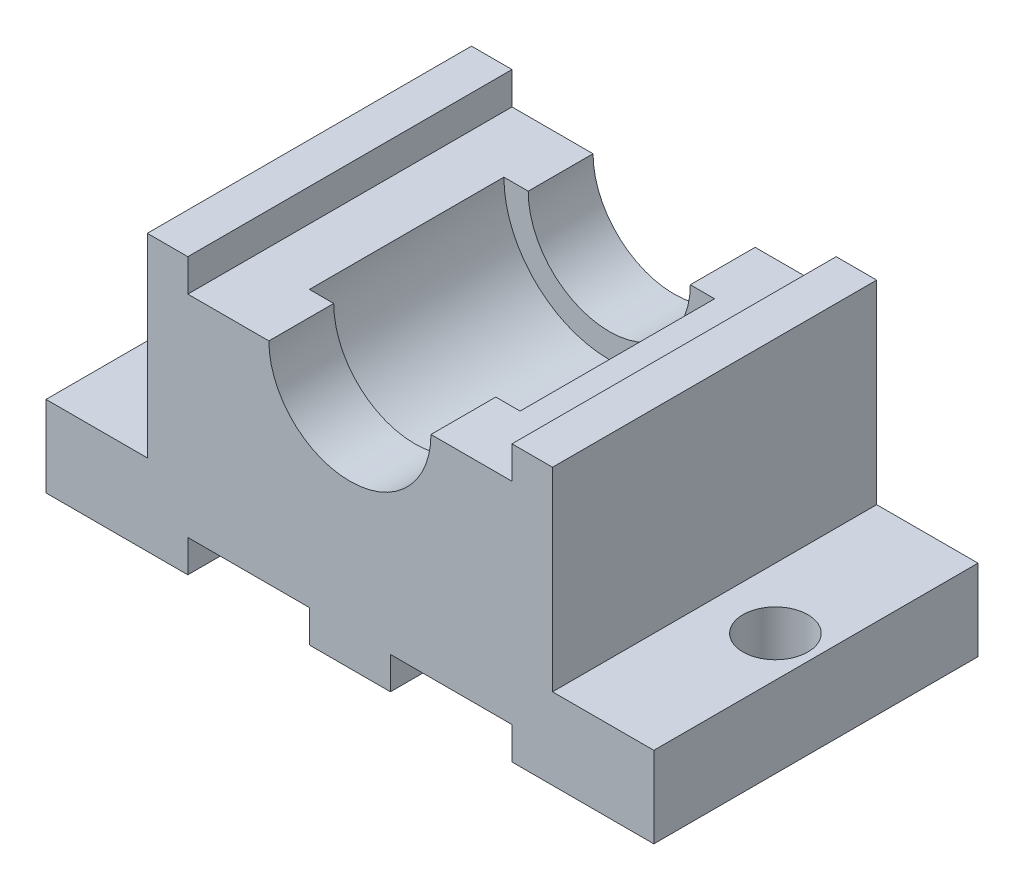
ISO-10303-21;
HEADER;
FILE_DESCRIPTION(('STEP AP214'),'2;1');
FILE_NAME('part.step','',(''),(''),'','','');
FILE_SCHEMA(('AUTOMOTIVE_DESIGN { 1 0 10303 214 1 1 1 1 }'));
ENDSEC;
DATA;
#1=APPLICATION_CONTEXT('core data for automotive mechanical design processes');
#2=APPLICATION_PROTOCOL_DEFINITION('international standard','automotive_design',2000,#1);
#3=PRODUCT_CONTEXT('',#1,'mechanical');
#4=PRODUCT('Part','Part','',(#3));
#5=PRODUCT_RELATED_PRODUCT_CATEGORY('part','',(#4));
#6=PRODUCT_DEFINITION_FORMATION('','',#4);
#7=PRODUCT_DEFINITION_CONTEXT('part definition',#1,'design');
#8=PRODUCT_DEFINITION('design','',#6,#7);
#9=PRODUCT_DEFINITION_SHAPE('','',#8);
#10=(LENGTH_UNIT() NAMED_UNIT(*) SI_UNIT(.MILLI.,.METRE.));
#11=(NAMED_UNIT(*) PLANE_ANGLE_UNIT() SI_UNIT($,.RADIAN.));
#12=(NAMED_UNIT(*) SI_UNIT($,.STERADIAN.) SOLID_ANGLE_UNIT());
#13=UNCERTAINTY_MEASURE_WITH_UNIT(LENGTH_MEASURE(1.E-05),#10,'distance_accuracy_value','');
#14=(GEOMETRIC_REPRESENTATION_CONTEXT(3) GLOBAL_UNCERTAINTY_ASSIGNED_CONTEXT((#13)) GLOBAL_UNIT_ASSIGNED_CONTEXT((#10,
#11,#12)) REPRESENTATION_CONTEXT('',''));
#15=CARTESIAN_POINT('',(0.,0.,0.));
#16=DIRECTION('',(0.,0.,1.));
#17=DIRECTION('',(1.,0.,0.));
#18=AXIS2_PLACEMENT_3D('',#15,#16,#17);
#19=CARTESIAN_POINT('',(20.,30.,20.));
#20=DIRECTION('',(0.,-1.,0.));
#21=DIRECTION('',(1.,0.,0.));
#22=AXIS2_PLACEMENT_3D('',#19,#20,#21);
#23=PLANE('',#22);
#24=DIRECTION('',(-1.,0.,0.));
#25=VECTOR('',#24,1.);
#26=CARTESIAN_POINT('',(20.,30.,-12.));
#27=LINE('',#26,#25);
#28=CARTESIAN_POINT('',(13.,30.,-12.));
#29=VERTEX_POINT('',#28);
#30=CARTESIAN_POINT('',(10.,30.,-12.));
#31=VERTEX_POINT('',#30);
#32=EDGE_CURVE('E436',#29,#31,#27,.T.);
#33=ORIENTED_EDGE('',*,*,#32,.F.);
#34=DIRECTION('',(0.,0.,1.));
#35=VECTOR('',#34,1.);
#36=CARTESIAN_POINT('',(13.,30.,-12.));
#37=LINE('',#36,#35);
#38=CARTESIAN_POINT('',(13.,30.,12.));
#39=VERTEX_POINT('',#38);
#40=EDGE_CURVE('E248',#29,#39,#37,.T.);
#41=ORIENTED_EDGE('',*,*,#40,.T.);
#42=DIRECTION('',(-1.,0.,0.));
#43=VECTOR('',#42,1.);
#44=CARTESIAN_POINT('',(20.,30.,12.));
#45=LINE('',#44,#43);
#46=CARTESIAN_POINT('',(10.,30.,12.));
#47=VERTEX_POINT('',#46);
#48=EDGE_CURVE('E421',#39,#47,#45,.T.);
#49=ORIENTED_EDGE('',*,*,#48,.T.);
#50=DIRECTION('',(0.,0.,-1.));
#51=VECTOR('',#50,1.);
#52=CARTESIAN_POINT('',(10.,30.,20.));
#53=LINE('',#52,#51);
#54=CARTESIAN_POINT('',(10.,30.,20.));
#55=VERTEX_POINT('',#54);
#56=EDGE_CURVE('E352',#55,#47,#53,.T.);
#57=ORIENTED_EDGE('',*,*,#56,.F.);
#58=DIRECTION('',(-1.,0.,0.));
#59=VECTOR('',#58,1.);
#60=CARTESIAN_POINT('',(20.,30.,20.));
#61=LINE('',#60,#59);
#62=CARTESIAN_POINT('',(20.,30.,20.));
#63=VERTEX_POINT('',#62);
#64=EDGE_CURVE('E466',#63,#55,#61,.T.);
#65=ORIENTED_EDGE('',*,*,#64,.F.);
#66=DIRECTION('',(0.,0.,-1.));
#67=VECTOR('',#66,1.);
#68=CARTESIAN_POINT('',(20.,30.,20.));
#69=LINE('',#68,#67);
#70=CARTESIAN_POINT('',(20.,30.,-20.));
#71=VERTEX_POINT('',#70);
#72=EDGE_CURVE('E356',#63,#71,#69,.T.);
#73=ORIENTED_EDGE('',*,*,#72,.T.);
#74=DIRECTION('',(-1.,0.,0.));
#75=VECTOR('',#74,1.);
#76=CARTESIAN_POINT('',(20.,30.,-20.));
#77=LINE('',#76,#75);
#78=CARTESIAN_POINT('',(10.,30.,-20.));
#79=VERTEX_POINT('',#78);
#80=EDGE_CURVE('E272',#71,#79,#77,.T.);
#81=ORIENTED_EDGE('',*,*,#80,.T.);
#82=EDGE_CURVE('E351',#31,#79,#53,.T.);
#83=ORIENTED_EDGE('',*,*,#82,.F.);
#84=EDGE_LOOP('',(#33,#41,#49,#57,#65,#73,#81,#83));
#85=FACE_BOUND('',#84,.T.);
#86=ADVANCED_FACE('F45',(#85),#23,.F.);
#87=CARTESIAN_POINT('',(0.,30.,20.));
#88=DIRECTION('',(0.,0.,-1.));
#89=DIRECTION('',(-1.,0.,0.));
#90=AXIS2_PLACEMENT_3D('',#87,#88,#89);
#91=CYLINDRICAL_SURFACE('',#90,10.);
#92=CARTESIAN_POINT('',(0.,30.,-12.));
#93=DIRECTION('',(0.,0.,1.));
#94=DIRECTION('',(1.,0.,0.));
#95=AXIS2_PLACEMENT_3D('',#92,#93,#94);
#96=CIRCLE('',#95,10.);
#97=CARTESIAN_POINT('',(-10.,30.,-12.));
#98=VERTEX_POINT('',#97);
#99=EDGE_CURVE('E432',#31,#98,#96,.F.);
#100=ORIENTED_EDGE('',*,*,#99,.F.);
#101=ORIENTED_EDGE('',*,*,#82,.T.);
#102=CARTESIAN_POINT('',(0.,30.,-20.));
#103=DIRECTION('',(0.,0.,-1.));
#104=DIRECTION('',(1.,0.,0.));
#105=AXIS2_PLACEMENT_3D('',#102,#103,#104);
#106=CIRCLE('',#105,10.);
#107=CARTESIAN_POINT('',(-10.,30.,-20.));
#108=VERTEX_POINT('',#107);
#109=EDGE_CURVE('E276',#79,#108,#106,.T.);
#110=ORIENTED_EDGE('',*,*,#109,.T.);
#111=DIRECTION('',(0.,0.,-1.));
#112=VECTOR('',#111,1.);
#113=CARTESIAN_POINT('',(-10.,30.,20.));
#114=LINE('',#113,#112);
#115=EDGE_CURVE('E346',#98,#108,#114,.T.);
#116=ORIENTED_EDGE('',*,*,#115,.F.);
#117=EDGE_LOOP('',(#100,#101,#110,#116));
#118=FACE_BOUND('',#117,.T.);
#119=ADVANCED_FACE('F585',(#118),#91,.F.);
#120=CARTESIAN_POINT('',(-20.,30.,20.));
#121=DIRECTION('',(0.,-1.,0.));
#122=DIRECTION('',(1.,0.,0.));
#123=AXIS2_PLACEMENT_3D('',#120,#121,#122);
#124=PLANE('',#123);
#125=DIRECTION('',(-1.,0.,0.));
#126=VECTOR('',#125,1.);
#127=CARTESIAN_POINT('',(-20.,30.,-12.));
#128=LINE('',#127,#126);
#129=CARTESIAN_POINT('',(-13.,30.,-12.));
#130=VERTEX_POINT('',#129);
#131=EDGE_CURVE('E11',#98,#130,#128,.T.);
#132=ORIENTED_EDGE('',*,*,#131,.F.);
#133=ORIENTED_EDGE('',*,*,#115,.T.);
#134=DIRECTION('',(-1.,0.,0.));
#135=VECTOR('',#134,1.);
#136=CARTESIAN_POINT('',(-20.,30.,-20.));
#137=LINE('',#136,#135);
#138=CARTESIAN_POINT('',(-20.,30.,-20.));
#139=VERTEX_POINT('',#138);
#140=EDGE_CURVE('E280',#108,#139,#137,.T.);
#141=ORIENTED_EDGE('',*,*,#140,.T.);
#142=DIRECTION('',(0.,0.,-1.));
#143=VECTOR('',#142,1.);
#144=CARTESIAN_POINT('',(-20.,30.,20.));
#145=LINE('',#144,#143);
#146=CARTESIAN_POINT('',(-20.,30.,20.));
#147=VERTEX_POINT('',#146);
#148=EDGE_CURVE('E342',#147,#139,#145,.T.);
#149=ORIENTED_EDGE('',*,*,#148,.F.);
#150=DIRECTION('',(-1.,0.,0.));
#151=VECTOR('',#150,1.);
#152=CARTESIAN_POINT('',(-20.,30.,20.));
#153=LINE('',#152,#151);
#154=CARTESIAN_POINT('',(-10.,30.,20.));
#155=VERTEX_POINT('',#154);
#156=EDGE_CURVE('E472',#155,#147,#153,.T.);
#157=ORIENTED_EDGE('',*,*,#156,.F.);
#158=CARTESIAN_POINT('',(-10.,30.,12.));
#159=VERTEX_POINT('',#158);
#160=EDGE_CURVE('E347',#155,#159,#114,.T.);
#161=ORIENTED_EDGE('',*,*,#160,.T.);
#162=DIRECTION('',(-1.,0.,0.));
#163=VECTOR('',#162,1.);
#164=CARTESIAN_POINT('',(-20.,30.,12.));
#165=LINE('',#164,#163);
#166=CARTESIAN_POINT('',(-13.,30.,12.));
#167=VERTEX_POINT('',#166);
#168=EDGE_CURVE('E391',#159,#167,#165,.T.);
#169=ORIENTED_EDGE('',*,*,#168,.T.);
#170=DIRECTION('',(0.,0.,1.));
#171=VECTOR('',#170,1.);
#172=CARTESIAN_POINT('',(-13.,30.,-12.));
#173=LINE('',#172,#171);
#174=EDGE_CURVE('E54',#167,#130,#173,.F.);
#175=ORIENTED_EDGE('',*,*,#174,.T.);
#176=EDGE_LOOP('',(#132,#133,#141,#149,#157,#161,#169,#175));
#177=FACE_BOUND('',#176,.T.);
#178=ADVANCED_FACE('F399',(#177),#124,.F.);
#179=CARTESIAN_POINT('',(5.,0.,20.));
#180=DIRECTION('',(-1.,0.,0.));
#181=DIRECTION('',(0.,0.,1.));
#182=AXIS2_PLACEMENT_3D('',#179,#180,#181);
#183=PLANE('',#182);
#184=DIRECTION('',(0.,1.,0.));
#185=VECTOR('',#184,1.);
#186=CARTESIAN_POINT('',(5.,0.,-20.));
#187=LINE('',#186,#185);
#188=CARTESIAN_POINT('',(5.,0.,-20.));
#189=VERTEX_POINT('',#188);
#190=CARTESIAN_POINT('',(5.,3.99999999999998,-20.));
#191=VERTEX_POINT('',#190);
#192=EDGE_CURVE('E243',#189,#191,#187,.T.);
#193=ORIENTED_EDGE('',*,*,#192,.T.);
#194=DIRECTION('',(0.,0.,-1.));
#195=VECTOR('',#194,1.);
#196=CARTESIAN_POINT('',(5.,3.99999999999998,20.));
#197=LINE('',#196,#195);
#198=CARTESIAN_POINT('',(5.,3.99999999999998,20.));
#199=VERTEX_POINT('',#198);
#200=EDGE_CURVE('E388',#199,#191,#197,.T.);
#201=ORIENTED_EDGE('',*,*,#200,.F.);
#202=DIRECTION('',(0.,1.,0.));
#203=VECTOR('',#202,1.);
#204=CARTESIAN_POINT('',(5.,0.,20.));
#205=LINE('',#204,#203);
#206=CARTESIAN_POINT('',(5.,0.,20.));
#207=VERTEX_POINT('',#206);
#208=EDGE_CURVE('E311',#207,#199,#205,.T.);
#209=ORIENTED_EDGE('',*,*,#208,.F.);
#210=DIRECTION('',(0.,0.,-1.));
#211=VECTOR('',#210,1.);
#212=CARTESIAN_POINT('',(5.,0.,20.));
#213=LINE('',#212,#211);
#214=EDGE_CURVE('E239',#207,#189,#213,.T.);
#215=ORIENTED_EDGE('',*,*,#214,.T.);
#216=EDGE_LOOP('',(#193,#201,#209,#215));
#217=FACE_BOUND('',#216,.T.);
#218=ADVANCED_FACE('F47',(#217),#183,.F.);
#219=CARTESIAN_POINT('',(5.,3.99999999999998,20.));
#220=DIRECTION('',(0.,1.,0.));
#221=DIRECTION('',(0.,0.,1.));
#222=AXIS2_PLACEMENT_3D('',#219,#220,#221);
#223=PLANE('',#222);
#224=DIRECTION('',(1.,0.,0.));
#225=VECTOR('',#224,1.);
#226=CARTESIAN_POINT('',(5.,3.99999999999998,-20.));
#227=LINE('',#226,#225);
#228=CARTESIAN_POINT('',(20.,3.99999999999998,-20.));
#229=VERTEX_POINT('',#228);
#230=EDGE_CURVE('E247',#191,#229,#227,.T.);
#231=ORIENTED_EDGE('',*,*,#230,.T.);
#232=DIRECTION('',(0.,0.,-1.));
#233=VECTOR('',#232,1.);
#234=CARTESIAN_POINT('',(20.,3.99999999999998,20.));
#235=LINE('',#234,#233);
#236=CARTESIAN_POINT('',(20.,3.99999999999998,20.));
#237=VERTEX_POINT('',#236);
#238=EDGE_CURVE('E384',#237,#229,#235,.T.);
#239=ORIENTED_EDGE('',*,*,#238,.F.);
#240=DIRECTION('',(1.,0.,0.));
#241=VECTOR('',#240,1.);
#242=CARTESIAN_POINT('',(5.,3.99999999999998,20.));
#243=LINE('',#242,#241);
#244=EDGE_CURVE('E154',#199,#237,#243,.T.);
#245=ORIENTED_EDGE('',*,*,#244,.F.);
#246=ORIENTED_EDGE('',*,*,#200,.T.);
#247=EDGE_LOOP('',(#231,#239,#245,#246));
#248=FACE_BOUND('',#247,.T.);
#249=ADVANCED_FACE('F512',(#248),#223,.F.);
#250=CARTESIAN_POINT('',(20.,3.99999999999998,20.));
#251=DIRECTION('',(1.,0.,0.));
#252=DIRECTION('',(0.,1.,0.));
#253=AXIS2_PLACEMENT_3D('',#250,#251,#252);
#254=PLANE('',#253);
#255=DIRECTION('',(0.,-1.,0.));
#256=VECTOR('',#255,1.);
#257=CARTESIAN_POINT('',(20.,3.99999999999998,-20.));
#258=LINE('',#257,#256);
#259=CARTESIAN_POINT('',(20.,0.,-20.));
#260=VERTEX_POINT('',#259);
#261=EDGE_CURVE('E251',#229,#260,#258,.T.);
#262=ORIENTED_EDGE('',*,*,#261,.T.);
#263=DIRECTION('',(0.,0.,-1.));
#264=VECTOR('',#263,1.);
#265=CARTESIAN_POINT('',(20.,0.,20.));
#266=LINE('',#265,#264);
#267=CARTESIAN_POINT('',(20.,0.,20.));
#268=VERTEX_POINT('',#267);
#269=EDGE_CURVE('E380',#268,#260,#266,.T.);
#270=ORIENTED_EDGE('',*,*,#269,.F.);
#271=DIRECTION('',(0.,-1.,0.));
#272=VECTOR('',#271,1.);
#273=CARTESIAN_POINT('',(20.,3.99999999999998,20.));
#274=LINE('',#273,#272);
#275=EDGE_CURVE('E445',#237,#268,#274,.T.);
#276=ORIENTED_EDGE('',*,*,#275,.F.);
#277=ORIENTED_EDGE('',*,*,#238,.T.);
#278=EDGE_LOOP('',(#262,#270,#276,#277));
#279=FACE_BOUND('',#278,.T.);
#280=ADVANCED_FACE('F515',(#279),#254,.F.);
#281=CARTESIAN_POINT('',(20.,0.,20.));
#282=DIRECTION('',(0.,1.,0.));
#283=DIRECTION('',(-1.,0.,0.));
#284=AXIS2_PLACEMENT_3D('',#281,#282,#283);
#285=PLANE('',#284);
#286=CARTESIAN_POINT('',(32.5,0.,0.));
#287=DIRECTION('',(0.,1.,0.));
#288=DIRECTION('',(1.,0.,0.));
#289=AXIS2_PLACEMENT_3D('',#286,#287,#288);
#290=CIRCLE('',#289,4.00000000000001);
#291=CARTESIAN_POINT('',(28.5,0.,0.));
#292=VERTEX_POINT('',#291);
#293=EDGE_CURVE('E426',#292,#292,#290,.T.);
#294=ORIENTED_EDGE('',*,*,#293,.T.);
#295=EDGE_LOOP('',(#294));
#296=FACE_BOUND('',#295,.T.);
#297=DIRECTION('',(1.,0.,0.));
#298=VECTOR('',#297,1.);
#299=CARTESIAN_POINT('',(20.,0.,-20.));
#300=LINE('',#299,#298);
#301=CARTESIAN_POINT('',(37.5,0.,-20.));
#302=VERTEX_POINT('',#301);
#303=EDGE_CURVE('E254',#260,#302,#300,.T.);
#304=ORIENTED_EDGE('',*,*,#303,.T.);
#305=DIRECTION('',(0.,0.,-1.));
#306=VECTOR('',#305,1.);
#307=CARTESIAN_POINT('',(37.5,0.,20.));
#308=LINE('',#307,#306);
#309=CARTESIAN_POINT('',(37.5,0.,20.));
#310=VERTEX_POINT('',#309);
#311=EDGE_CURVE('E376',#310,#302,#308,.T.);
#312=ORIENTED_EDGE('',*,*,#311,.F.);
#313=DIRECTION('',(1.,0.,0.));
#314=VECTOR('',#313,1.);
#315=CARTESIAN_POINT('',(20.,0.,20.));
#316=LINE('',#315,#314);
#317=EDGE_CURVE('E448',#268,#310,#316,.T.);
#318=ORIENTED_EDGE('',*,*,#317,.F.);
#319=ORIENTED_EDGE('',*,*,#269,.T.);
#320=EDGE_LOOP('',(#304,#312,#318,#319));
#321=FACE_BOUND('',#320,.T.);
#322=ADVANCED_FACE('F520',(#296,#321),#285,.F.);
#323=CARTESIAN_POINT('',(37.5,0.,20.));
#324=DIRECTION('',(-1.,0.,0.));
#325=DIRECTION('',(0.,-1.,0.));
#326=AXIS2_PLACEMENT_3D('',#323,#324,#325);
#327=PLANE('',#326);
#328=DIRECTION('',(0.,1.,0.));
#329=VECTOR('',#328,1.);
#330=CARTESIAN_POINT('',(37.5,0.,-20.));
#331=LINE('',#330,#329);
#332=CARTESIAN_POINT('',(37.5,9.99999999999997,-20.));
#333=VERTEX_POINT('',#332);
#334=EDGE_CURVE('E257',#302,#333,#331,.T.);
#335=ORIENTED_EDGE('',*,*,#334,.T.);
#336=DIRECTION('',(0.,0.,-1.));
#337=VECTOR('',#336,1.);
#338=CARTESIAN_POINT('',(37.5,9.99999999999997,20.));
#339=LINE('',#338,#337);
#340=CARTESIAN_POINT('',(37.5,9.99999999999997,20.));
#341=VERTEX_POINT('',#340);
#342=EDGE_CURVE('E372',#341,#333,#339,.T.);
#343=ORIENTED_EDGE('',*,*,#342,.F.);
#344=DIRECTION('',(0.,1.,0.));
#345=VECTOR('',#344,1.);
#346=CARTESIAN_POINT('',(37.5,0.,20.));
#347=LINE('',#346,#345);
#348=EDGE_CURVE('E451',#310,#341,#347,.T.);
#349=ORIENTED_EDGE('',*,*,#348,.F.);
#350=ORIENTED_EDGE('',*,*,#311,.T.);
#351=EDGE_LOOP('',(#335,#343,#349,#350));
#352=FACE_BOUND('',#351,.T.);
#353=ADVANCED_FACE('F526',(#352),#327,.F.);
#354=CARTESIAN_POINT('',(37.5,9.99999999999997,20.));
#355=DIRECTION('',(0.,-1.,0.));
#356=DIRECTION('',(1.,0.,0.));
#357=AXIS2_PLACEMENT_3D('',#354,#355,#356);
#358=PLANE('',#357);
#359=CARTESIAN_POINT('',(32.5,9.99999999999998,0.));
#360=DIRECTION('',(0.,1.,0.));
#361=DIRECTION('',(1.,0.,0.));
#362=AXIS2_PLACEMENT_3D('',#359,#360,#361);
#363=CIRCLE('',#362,4.00000000000001);
#364=CARTESIAN_POINT('',(28.5,9.99999999999998,0.));
#365=VERTEX_POINT('',#364);
#366=EDGE_CURVE('E706',#365,#365,#363,.T.);
#367=ORIENTED_EDGE('',*,*,#366,.F.);
#368=EDGE_LOOP('',(#367));
#369=FACE_BOUND('',#368,.T.);
#370=DIRECTION('',(-1.,0.,0.));
#371=VECTOR('',#370,1.);
#372=CARTESIAN_POINT('',(37.5,9.99999999999997,-20.));
#373=LINE('',#372,#371);
#374=CARTESIAN_POINT('',(25.,9.99999999999998,-20.));
#375=VERTEX_POINT('',#374);
#376=EDGE_CURVE('E260',#333,#375,#373,.T.);
#377=ORIENTED_EDGE('',*,*,#376,.T.);
#378=DIRECTION('',(0.,0.,-1.));
#379=VECTOR('',#378,1.);
#380=CARTESIAN_POINT('',(25.,9.99999999999998,20.));
#381=LINE('',#380,#379);
#382=CARTESIAN_POINT('',(25.,9.99999999999998,20.));
#383=VERTEX_POINT('',#382);
#384=EDGE_CURVE('E368',#383,#375,#381,.T.);
#385=ORIENTED_EDGE('',*,*,#384,.F.);
#386=DIRECTION('',(-1.,0.,0.));
#387=VECTOR('',#386,1.);
#388=CARTESIAN_POINT('',(37.5,9.99999999999997,20.));
#389=LINE('',#388,#387);
#390=EDGE_CURVE('E454',#341,#383,#389,.T.);
#391=ORIENTED_EDGE('',*,*,#390,.F.);
#392=ORIENTED_EDGE('',*,*,#342,.T.);
#393=EDGE_LOOP('',(#377,#385,#391,#392));
#394=FACE_BOUND('',#393,.T.);
#395=ADVANCED_FACE('F530',(#369,#394),#358,.F.);
#396=CARTESIAN_POINT('',(25.,9.99999999999998,20.));
#397=DIRECTION('',(-1.,0.,0.));
#398=DIRECTION('',(0.,0.,1.));
#399=AXIS2_PLACEMENT_3D('',#396,#397,#398);
#400=PLANE('',#399);
#401=DIRECTION('',(0.,1.,0.));
#402=VECTOR('',#401,1.);
#403=CARTESIAN_POINT('',(25.,9.99999999999998,-20.));
#404=LINE('',#403,#402);
#405=CARTESIAN_POINT('',(25.,34.,-20.));
#406=VERTEX_POINT('',#405);
#407=EDGE_CURVE('E263',#375,#406,#404,.T.);
#408=ORIENTED_EDGE('',*,*,#407,.T.);
#409=DIRECTION('',(0.,0.,-1.));
#410=VECTOR('',#409,1.);
#411=CARTESIAN_POINT('',(25.,34.,20.));
#412=LINE('',#411,#410);
#413=CARTESIAN_POINT('',(25.,34.,20.));
#414=VERTEX_POINT('',#413);
#415=EDGE_CURVE('E364',#414,#406,#412,.T.);
#416=ORIENTED_EDGE('',*,*,#415,.F.);
#417=DIRECTION('',(0.,1.,0.));
#418=VECTOR('',#417,1.);
#419=CARTESIAN_POINT('',(25.,9.99999999999998,20.));
#420=LINE('',#419,#418);
#421=EDGE_CURVE('E457',#383,#414,#420,.T.);
#422=ORIENTED_EDGE('',*,*,#421,.F.);
#423=ORIENTED_EDGE('',*,*,#384,.T.);
#424=EDGE_LOOP('',(#408,#416,#422,#423));
#425=FACE_BOUND('',#424,.T.);
#426=ADVANCED_FACE('F535',(#425),#400,.F.);
#427=CARTESIAN_POINT('',(25.,34.,20.));
#428=DIRECTION('',(0.,-1.,0.));
#429=DIRECTION('',(0.,0.,-1.));
#430=AXIS2_PLACEMENT_3D('',#427,#428,#429);
#431=PLANE('',#430);
#432=DIRECTION('',(-1.,0.,0.));
#433=VECTOR('',#432,1.);
#434=CARTESIAN_POINT('',(25.,34.,-20.));
#435=LINE('',#434,#433);
#436=CARTESIAN_POINT('',(20.,34.,-20.));
#437=VERTEX_POINT('',#436);
#438=EDGE_CURVE('E266',#406,#437,#435,.T.);
#439=ORIENTED_EDGE('',*,*,#438,.T.);
#440=DIRECTION('',(0.,0.,-1.));
#441=VECTOR('',#440,1.);
#442=CARTESIAN_POINT('',(20.,34.,20.));
#443=LINE('',#442,#441);
#444=CARTESIAN_POINT('',(20.,34.,20.));
#445=VERTEX_POINT('',#444);
#446=EDGE_CURVE('E360',#445,#437,#443,.T.);
#447=ORIENTED_EDGE('',*,*,#446,.F.);
#448=DIRECTION('',(-1.,0.,0.));
#449=VECTOR('',#448,1.);
#450=CARTESIAN_POINT('',(25.,34.,20.));
#451=LINE('',#450,#449);
#452=EDGE_CURVE('E460',#414,#445,#451,.T.);
#453=ORIENTED_EDGE('',*,*,#452,.F.);
#454=ORIENTED_EDGE('',*,*,#415,.T.);
#455=EDGE_LOOP('',(#439,#447,#453,#454));
#456=FACE_BOUND('',#455,.T.);
#457=ADVANCED_FACE('F541',(#456),#431,.F.);
#458=CARTESIAN_POINT('',(20.,34.,20.));
#459=DIRECTION('',(1.,0.,0.));
#460=DIRECTION('',(0.,1.,0.));
#461=AXIS2_PLACEMENT_3D('',#458,#459,#460);
#462=PLANE('',#461);
#463=DIRECTION('',(0.,-1.,0.));
#464=VECTOR('',#463,1.);
#465=CARTESIAN_POINT('',(20.,34.,-20.));
#466=LINE('',#465,#464);
#467=EDGE_CURVE('E269',#437,#71,#466,.T.);
#468=ORIENTED_EDGE('',*,*,#467,.T.);
#469=ORIENTED_EDGE('',*,*,#72,.F.);
#470=DIRECTION('',(0.,-1.,0.));
#471=VECTOR('',#470,1.);
#472=CARTESIAN_POINT('',(20.,34.,20.));
#473=LINE('',#472,#471);
#474=EDGE_CURVE('E463',#445,#63,#473,.T.);
#475=ORIENTED_EDGE('',*,*,#474,.F.);
#476=ORIENTED_EDGE('',*,*,#446,.T.);
#477=EDGE_LOOP('',(#468,#469,#475,#476));
#478=FACE_BOUND('',#477,.T.);
#479=ADVANCED_FACE('F545',(#478),#462,.F.);
#480=ORIENTED_EDGE('',*,*,#56,.T.);
#481=CARTESIAN_POINT('',(0.,30.,12.));
#482=DIRECTION('',(0.,0.,1.));
#483=DIRECTION('',(1.,0.,0.));
#484=AXIS2_PLACEMENT_3D('',#481,#482,#483);
#485=CIRCLE('',#484,10.);
#486=EDGE_CURVE('E416',#47,#159,#485,.F.);
#487=ORIENTED_EDGE('',*,*,#486,.T.);
#488=ORIENTED_EDGE('',*,*,#160,.F.);
#489=CARTESIAN_POINT('',(0.,30.,20.));
#490=DIRECTION('',(0.,0.,-1.));
#491=DIRECTION('',(1.,0.,0.));
#492=AXIS2_PLACEMENT_3D('',#489,#490,#491);
#493=CIRCLE('',#492,10.);
#494=EDGE_CURVE('E469',#55,#155,#493,.T.);
#495=ORIENTED_EDGE('',*,*,#494,.F.);
#496=EDGE_LOOP('',(#480,#487,#488,#495));
#497=FACE_BOUND('',#496,.T.);
#498=ADVANCED_FACE('F555',(#497),#91,.F.);
#499=CARTESIAN_POINT('',(-20.,34.,20.));
#500=DIRECTION('',(-1.,0.,0.));
#501=DIRECTION('',(0.,-1.,0.));
#502=AXIS2_PLACEMENT_3D('',#499,#500,#501);
#503=PLANE('',#502);
#504=DIRECTION('',(0.,1.,0.));
#505=VECTOR('',#504,1.);
#506=CARTESIAN_POINT('',(-20.,34.,-20.));
#507=LINE('',#506,#505);
#508=CARTESIAN_POINT('',(-20.,34.,-20.));
#509=VERTEX_POINT('',#508);
#510=EDGE_CURVE('E283',#139,#509,#507,.T.);
#511=ORIENTED_EDGE('',*,*,#510,.T.);
#512=DIRECTION('',(0.,0.,-1.));
#513=VECTOR('',#512,1.);
#514=CARTESIAN_POINT('',(-20.,34.,20.));
#515=LINE('',#514,#513);
#516=CARTESIAN_POINT('',(-20.,34.,20.));
#517=VERTEX_POINT('',#516);
#518=EDGE_CURVE('E338',#517,#509,#515,.T.);
#519=ORIENTED_EDGE('',*,*,#518,.F.);
#520=DIRECTION('',(0.,1.,0.));
#521=VECTOR('',#520,1.);
#522=CARTESIAN_POINT('',(-20.,34.,20.));
#523=LINE('',#522,#521);
#524=EDGE_CURVE('E475',#147,#517,#523,.T.);
#525=ORIENTED_EDGE('',*,*,#524,.F.);
#526=ORIENTED_EDGE('',*,*,#148,.T.);
#527=EDGE_LOOP('',(#511,#519,#525,#526));
#528=FACE_BOUND('',#527,.T.);
#529=ADVANCED_FACE('F563',(#528),#503,.F.);
#530=CARTESIAN_POINT('',(-25.,34.,20.));
#531=DIRECTION('',(0.,-1.,0.));
#532=DIRECTION('',(0.,0.,-1.));
#533=AXIS2_PLACEMENT_3D('',#530,#531,#532);
#534=PLANE('',#533);
#535=DIRECTION('',(-1.,0.,0.));
#536=VECTOR('',#535,1.);
#537=CARTESIAN_POINT('',(-25.,34.,-20.));
#538=LINE('',#537,#536);
#539=CARTESIAN_POINT('',(-25.,34.,-20.));
#540=VERTEX_POINT('',#539);
#541=EDGE_CURVE('E286',#509,#540,#538,.T.);
#542=ORIENTED_EDGE('',*,*,#541,.T.);
#543=DIRECTION('',(0.,0.,-1.));
#544=VECTOR('',#543,1.);
#545=CARTESIAN_POINT('',(-25.,34.,20.));
#546=LINE('',#545,#544);
#547=CARTESIAN_POINT('',(-25.,34.,20.));
#548=VERTEX_POINT('',#547);
#549=EDGE_CURVE('E334',#548,#540,#546,.T.);
#550=ORIENTED_EDGE('',*,*,#549,.F.);
#551=DIRECTION('',(-1.,0.,0.));
#552=VECTOR('',#551,1.);
#553=CARTESIAN_POINT('',(-25.,34.,20.));
#554=LINE('',#553,#552);
#555=EDGE_CURVE('E478',#517,#548,#554,.T.);
#556=ORIENTED_EDGE('',*,*,#555,.F.);
#557=ORIENTED_EDGE('',*,*,#518,.T.);
#558=EDGE_LOOP('',(#542,#550,#556,#557));
#559=FACE_BOUND('',#558,.T.);
#560=ADVANCED_FACE('F569',(#559),#534,.F.);
#561=CARTESIAN_POINT('',(-25.,9.99999999999998,20.));
#562=DIRECTION('',(1.,0.,0.));
#563=DIRECTION('',(0.,0.,-1.));
#564=AXIS2_PLACEMENT_3D('',#561,#562,#563);
#565=PLANE('',#564);
#566=DIRECTION('',(0.,-1.,0.));
#567=VECTOR('',#566,1.);
#568=CARTESIAN_POINT('',(-25.,9.99999999999998,-20.));
#569=LINE('',#568,#567);
#570=CARTESIAN_POINT('',(-25.,9.99999999999998,-20.));
#571=VERTEX_POINT('',#570);
#572=EDGE_CURVE('E289',#540,#571,#569,.T.);
#573=ORIENTED_EDGE('',*,*,#572,.T.);
#574=DIRECTION('',(0.,0.,-1.));
#575=VECTOR('',#574,1.);
#576=CARTESIAN_POINT('',(-25.,9.99999999999998,20.));
#577=LINE('',#576,#575);
#578=CARTESIAN_POINT('',(-25.,9.99999999999998,20.));
#579=VERTEX_POINT('',#578);
#580=EDGE_CURVE('E330',#579,#571,#577,.T.);
#581=ORIENTED_EDGE('',*,*,#580,.F.);
#582=DIRECTION('',(0.,-1.,0.));
#583=VECTOR('',#582,1.);
#584=CARTESIAN_POINT('',(-25.,9.99999999999998,20.));
#585=LINE('',#584,#583);
#586=EDGE_CURVE('E481',#548,#579,#585,.T.);
#587=ORIENTED_EDGE('',*,*,#586,.F.);
#588=ORIENTED_EDGE('',*,*,#549,.T.);
#589=EDGE_LOOP('',(#573,#581,#587,#588));
#590=FACE_BOUND('',#589,.T.);
#591=ADVANCED_FACE('F573',(#590),#565,.F.);
#592=CARTESIAN_POINT('',(-37.5,9.99999999999997,20.));
#593=DIRECTION('',(0.,-1.,0.));
#594=DIRECTION('',(1.,0.,0.));
#595=AXIS2_PLACEMENT_3D('',#592,#593,#594);
#596=PLANE('',#595);
#597=CARTESIAN_POINT('',(-32.5,9.99999999999997,0.));
#598=DIRECTION('',(0.,1.,0.));
#599=DIRECTION('',(-1.,0.,0.));
#600=AXIS2_PLACEMENT_3D('',#597,#598,#599);
#601=CIRCLE('',#600,4.);
#602=CARTESIAN_POINT('',(-36.5,9.99999999999997,0.));
#603=VERTEX_POINT('',#602);
#604=EDGE_CURVE('E708',#603,#603,#601,.T.);
#605=ORIENTED_EDGE('',*,*,#604,.F.);
#606=EDGE_LOOP('',(#605));
#607=FACE_BOUND('',#606,.T.);
#608=DIRECTION('',(-1.,0.,0.));
#609=VECTOR('',#608,1.);
#610=CARTESIAN_POINT('',(-37.5,9.99999999999997,-20.));
#611=LINE('',#610,#609);
#612=CARTESIAN_POINT('',(-37.5,9.99999999999997,-20.));
#613=VERTEX_POINT('',#612);
#614=EDGE_CURVE('E292',#571,#613,#611,.T.);
#615=ORIENTED_EDGE('',*,*,#614,.T.);
#616=DIRECTION('',(0.,0.,-1.));
#617=VECTOR('',#616,1.);
#618=CARTESIAN_POINT('',(-37.5,9.99999999999997,20.));
#619=LINE('',#618,#617);
#620=CARTESIAN_POINT('',(-37.5,9.99999999999997,20.));
#621=VERTEX_POINT('',#620);
#622=EDGE_CURVE('E326',#621,#613,#619,.T.);
#623=ORIENTED_EDGE('',*,*,#622,.F.);
#624=DIRECTION('',(-1.,0.,0.));
#625=VECTOR('',#624,1.);
#626=CARTESIAN_POINT('',(-37.5,9.99999999999997,20.));
#627=LINE('',#626,#625);
#628=EDGE_CURVE('E484',#579,#621,#627,.T.);
#629=ORIENTED_EDGE('',*,*,#628,.F.);
#630=ORIENTED_EDGE('',*,*,#580,.T.);
#631=EDGE_LOOP('',(#615,#623,#629,#630));
#632=FACE_BOUND('',#631,.T.);
#633=ADVANCED_FACE('F578',(#607,#632),#596,.F.);
#634=CARTESIAN_POINT('',(-37.5,0.,20.));
#635=DIRECTION('',(1.,0.,0.));
#636=DIRECTION('',(0.,1.,0.));
#637=AXIS2_PLACEMENT_3D('',#634,#635,#636);
#638=PLANE('',#637);
#639=DIRECTION('',(0.,-1.,0.));
#640=VECTOR('',#639,1.);
#641=CARTESIAN_POINT('',(-37.5,0.,-20.));
#642=LINE('',#641,#640);
#643=CARTESIAN_POINT('',(-37.5,0.,-20.));
#644=VERTEX_POINT('',#643);
#645=EDGE_CURVE('E295',#613,#644,#642,.T.);
#646=ORIENTED_EDGE('',*,*,#645,.T.);
#647=DIRECTION('',(0.,0.,-1.));
#648=VECTOR('',#647,1.);
#649=CARTESIAN_POINT('',(-37.5,0.,20.));
#650=LINE('',#649,#648);
#651=CARTESIAN_POINT('',(-37.5,0.,20.));
#652=VERTEX_POINT('',#651);
#653=EDGE_CURVE('E322',#652,#644,#650,.T.);
#654=ORIENTED_EDGE('',*,*,#653,.F.);
#655=DIRECTION('',(0.,-1.,0.));
#656=VECTOR('',#655,1.);
#657=CARTESIAN_POINT('',(-37.5,0.,20.));
#658=LINE('',#657,#656);
#659=EDGE_CURVE('E487',#621,#652,#658,.T.);
#660=ORIENTED_EDGE('',*,*,#659,.F.);
#661=ORIENTED_EDGE('',*,*,#622,.T.);
#662=EDGE_LOOP('',(#646,#654,#660,#661));
#663=FACE_BOUND('',#662,.T.);
#664=ADVANCED_FACE('F581',(#663),#638,.F.);
#665=CARTESIAN_POINT('',(-20.,0.,20.));
#666=DIRECTION('',(0.,1.,0.));
#667=DIRECTION('',(-1.,0.,0.));
#668=AXIS2_PLACEMENT_3D('',#665,#666,#667);
#669=PLANE('',#668);
#670=CARTESIAN_POINT('',(-32.5,0.,0.));
#671=DIRECTION('',(0.,1.,0.));
#672=DIRECTION('',(-1.,0.,0.));
#673=AXIS2_PLACEMENT_3D('',#670,#671,#672);
#674=CIRCLE('',#673,4.);
#675=CARTESIAN_POINT('',(-36.5,0.,0.));
#676=VERTEX_POINT('',#675);
#677=EDGE_CURVE('E423',#676,#676,#674,.T.);
#678=ORIENTED_EDGE('',*,*,#677,.T.);
#679=EDGE_LOOP('',(#678));
#680=FACE_BOUND('',#679,.T.);
#681=DIRECTION('',(1.,0.,0.));
#682=VECTOR('',#681,1.);
#683=CARTESIAN_POINT('',(-20.,0.,-20.));
#684=LINE('',#683,#682);
#685=CARTESIAN_POINT('',(-20.,0.,-20.));
#686=VERTEX_POINT('',#685);
#687=EDGE_CURVE('E298',#644,#686,#684,.T.);
#688=ORIENTED_EDGE('',*,*,#687,.T.);
#689=DIRECTION('',(0.,0.,-1.));
#690=VECTOR('',#689,1.);
#691=CARTESIAN_POINT('',(-20.,0.,20.));
#692=LINE('',#691,#690);
#693=CARTESIAN_POINT('',(-20.,0.,20.));
#694=VERTEX_POINT('',#693);
#695=EDGE_CURVE('E318',#694,#686,#692,.T.);
#696=ORIENTED_EDGE('',*,*,#695,.F.);
#697=DIRECTION('',(1.,0.,0.));
#698=VECTOR('',#697,1.);
#699=CARTESIAN_POINT('',(-20.,0.,20.));
#700=LINE('',#699,#698);
#701=EDGE_CURVE('E490',#652,#694,#700,.T.);
#702=ORIENTED_EDGE('',*,*,#701,.F.);
#703=ORIENTED_EDGE('',*,*,#653,.T.);
#704=EDGE_LOOP('',(#688,#696,#702,#703));
#705=FACE_BOUND('',#704,.T.);
#706=ADVANCED_FACE('F498',(#680,#705),#669,.F.);
#707=CARTESIAN_POINT('',(-20.,3.99999999999998,20.));
#708=DIRECTION('',(-1.,0.,0.));
#709=DIRECTION('',(0.,-1.,0.));
#710=AXIS2_PLACEMENT_3D('',#707,#708,#709);
#711=PLANE('',#710);
#712=DIRECTION('',(0.,1.,0.));
#713=VECTOR('',#712,1.);
#714=CARTESIAN_POINT('',(-20.,3.99999999999998,-20.));
#715=LINE('',#714,#713);
#716=CARTESIAN_POINT('',(-20.,3.99999999999998,-20.));
#717=VERTEX_POINT('',#716);
#718=EDGE_CURVE('E301',#686,#717,#715,.T.);
#719=ORIENTED_EDGE('',*,*,#718,.T.);
#720=DIRECTION('',(0.,0.,-1.));
#721=VECTOR('',#720,1.);
#722=CARTESIAN_POINT('',(-20.,3.99999999999998,20.));
#723=LINE('',#722,#721);
#724=CARTESIAN_POINT('',(-20.,3.99999999999998,20.));
#725=VERTEX_POINT('',#724);
#726=EDGE_CURVE('E232',#725,#717,#723,.T.);
#727=ORIENTED_EDGE('',*,*,#726,.F.);
#728=DIRECTION('',(0.,1.,0.));
#729=VECTOR('',#728,1.);
#730=CARTESIAN_POINT('',(-20.,3.99999999999998,20.));
#731=LINE('',#730,#729);
#732=EDGE_CURVE('E218',#694,#725,#731,.T.);
#733=ORIENTED_EDGE('',*,*,#732,.F.);
#734=ORIENTED_EDGE('',*,*,#695,.T.);
#735=EDGE_LOOP('',(#719,#727,#733,#734));
#736=FACE_BOUND('',#735,.T.);
#737=ADVANCED_FACE('F502',(#736),#711,.F.);
#738=CARTESIAN_POINT('',(-5.,3.99999999999998,20.));
#739=DIRECTION('',(0.,1.,0.));
#740=DIRECTION('',(0.,0.,1.));
#741=AXIS2_PLACEMENT_3D('',#738,#739,#740);
#742=PLANE('',#741);
#743=DIRECTION('',(1.,0.,0.));
#744=VECTOR('',#743,1.);
#745=CARTESIAN_POINT('',(-5.,3.99999999999998,-20.));
#746=LINE('',#745,#744);
#747=CARTESIAN_POINT('',(-5.,3.99999999999998,-20.));
#748=VERTEX_POINT('',#747);
#749=EDGE_CURVE('E228',#717,#748,#746,.T.);
#750=ORIENTED_EDGE('',*,*,#749,.T.);
#751=DIRECTION('',(0.,0.,-1.));
#752=VECTOR('',#751,1.);
#753=CARTESIAN_POINT('',(-5.,3.99999999999998,20.));
#754=LINE('',#753,#752);
#755=CARTESIAN_POINT('',(-5.,3.99999999999998,20.));
#756=VERTEX_POINT('',#755);
#757=EDGE_CURVE('E225',#756,#748,#754,.T.);
#758=ORIENTED_EDGE('',*,*,#757,.F.);
#759=DIRECTION('',(1.,0.,0.));
#760=VECTOR('',#759,1.);
#761=CARTESIAN_POINT('',(-5.,3.99999999999998,20.));
#762=LINE('',#761,#760);
#763=EDGE_CURVE('E211',#725,#756,#762,.T.);
#764=ORIENTED_EDGE('',*,*,#763,.F.);
#765=ORIENTED_EDGE('',*,*,#726,.T.);
#766=EDGE_LOOP('',(#750,#758,#764,#765));
#767=FACE_BOUND('',#766,.T.);
#768=ADVANCED_FACE('F226',(#767),#742,.F.);
#769=CARTESIAN_POINT('',(-5.,0.,20.));
#770=DIRECTION('',(1.,0.,0.));
#771=DIRECTION('',(0.,0.,-1.));
#772=AXIS2_PLACEMENT_3D('',#769,#770,#771);
#773=PLANE('',#772);
#774=DIRECTION('',(0.,-1.,0.));
#775=VECTOR('',#774,1.);
#776=CARTESIAN_POINT('',(-5.,0.,-20.));
#777=LINE('',#776,#775);
#778=CARTESIAN_POINT('',(-5.,0.,-20.));
#779=VERTEX_POINT('',#778);
#780=EDGE_CURVE('E306',#748,#779,#777,.T.);
#781=ORIENTED_EDGE('',*,*,#780,.T.);
#782=DIRECTION('',(0.,0.,-1.));
#783=VECTOR('',#782,1.);
#784=CARTESIAN_POINT('',(-5.,0.,20.));
#785=LINE('',#784,#783);
#786=CARTESIAN_POINT('',(-5.,0.,20.));
#787=VERTEX_POINT('',#786);
#788=EDGE_CURVE('E233',#787,#779,#785,.T.);
#789=ORIENTED_EDGE('',*,*,#788,.F.);
#790=DIRECTION('',(0.,-1.,0.));
#791=VECTOR('',#790,1.);
#792=CARTESIAN_POINT('',(-5.,0.,20.));
#793=LINE('',#792,#791);
#794=EDGE_CURVE('E215',#756,#787,#793,.T.);
#795=ORIENTED_EDGE('',*,*,#794,.F.);
#796=ORIENTED_EDGE('',*,*,#757,.T.);
#797=EDGE_LOOP('',(#781,#789,#795,#796));
#798=FACE_BOUND('',#797,.T.);
#799=ADVANCED_FACE('F235',(#798),#773,.F.);
#800=CARTESIAN_POINT('',(-5.,0.,20.));
#801=DIRECTION('',(0.,1.,0.));
#802=DIRECTION('',(-1.,0.,0.));
#803=AXIS2_PLACEMENT_3D('',#800,#801,#802);
#804=PLANE('',#803);
#805=DIRECTION('',(1.,0.,0.));
#806=VECTOR('',#805,1.);
#807=CARTESIAN_POINT('',(-5.,0.,-20.));
#808=LINE('',#807,#806);
#809=EDGE_CURVE('E145',#779,#189,#808,.T.);
#810=ORIENTED_EDGE('',*,*,#809,.T.);
#811=ORIENTED_EDGE('',*,*,#214,.F.);
#812=DIRECTION('',(1.,0.,0.));
#813=VECTOR('',#812,1.);
#814=CARTESIAN_POINT('',(-5.,0.,20.));
#815=LINE('',#814,#813);
#816=EDGE_CURVE('E70',#787,#207,#815,.T.);
#817=ORIENTED_EDGE('',*,*,#816,.F.);
#818=ORIENTED_EDGE('',*,*,#788,.T.);
#819=EDGE_LOOP('',(#810,#811,#817,#818));
#820=FACE_BOUND('',#819,.T.);
#821=ADVANCED_FACE('F506',(#820),#804,.F.);
#822=CARTESIAN_POINT('',(0.,30.,20.));
#823=DIRECTION('',(0.,0.,1.));
#824=DIRECTION('',(1.,0.,0.));
#825=AXIS2_PLACEMENT_3D('',#822,#823,#824);
#826=PLANE('',#825);
#827=ORIENTED_EDGE('',*,*,#208,.T.);
#828=ORIENTED_EDGE('',*,*,#244,.T.);
#829=ORIENTED_EDGE('',*,*,#275,.T.);
#830=ORIENTED_EDGE('',*,*,#317,.T.);
#831=ORIENTED_EDGE('',*,*,#348,.T.);
#832=ORIENTED_EDGE('',*,*,#390,.T.);
#833=ORIENTED_EDGE('',*,*,#421,.T.);
#834=ORIENTED_EDGE('',*,*,#452,.T.);
#835=ORIENTED_EDGE('',*,*,#474,.T.);
#836=ORIENTED_EDGE('',*,*,#64,.T.);
#837=ORIENTED_EDGE('',*,*,#494,.T.);
#838=ORIENTED_EDGE('',*,*,#156,.T.);
#839=ORIENTED_EDGE('',*,*,#524,.T.);
#840=ORIENTED_EDGE('',*,*,#555,.T.);
#841=ORIENTED_EDGE('',*,*,#586,.T.);
#842=ORIENTED_EDGE('',*,*,#628,.T.);
#843=ORIENTED_EDGE('',*,*,#659,.T.);
#844=ORIENTED_EDGE('',*,*,#701,.T.);
#845=ORIENTED_EDGE('',*,*,#732,.T.);
#846=ORIENTED_EDGE('',*,*,#763,.T.);
#847=ORIENTED_EDGE('',*,*,#794,.T.);
#848=ORIENTED_EDGE('',*,*,#816,.T.);
#849=EDGE_LOOP('',(#827,#828,#829,#830,#831,#832,#833,#834,#835,#836,#837,#838,#839,#840,#841,
#842,#843,#844,#845,#846,#847,#848));
#850=FACE_BOUND('',#849,.T.);
#851=ADVANCED_FACE('F213',(#850),#826,.T.);
#852=CARTESIAN_POINT('',(0.,30.,-20.));
#853=DIRECTION('',(0.,0.,1.));
#854=DIRECTION('',(1.,0.,0.));
#855=AXIS2_PLACEMENT_3D('',#852,#853,#854);
#856=PLANE('',#855);
#857=ORIENTED_EDGE('',*,*,#192,.F.);
#858=ORIENTED_EDGE('',*,*,#809,.F.);
#859=ORIENTED_EDGE('',*,*,#780,.F.);
#860=ORIENTED_EDGE('',*,*,#749,.F.);
#861=ORIENTED_EDGE('',*,*,#718,.F.);
#862=ORIENTED_EDGE('',*,*,#687,.F.);
#863=ORIENTED_EDGE('',*,*,#645,.F.);
#864=ORIENTED_EDGE('',*,*,#614,.F.);
#865=ORIENTED_EDGE('',*,*,#572,.F.);
#866=ORIENTED_EDGE('',*,*,#541,.F.);
#867=ORIENTED_EDGE('',*,*,#510,.F.);
#868=ORIENTED_EDGE('',*,*,#140,.F.);
#869=ORIENTED_EDGE('',*,*,#109,.F.);
#870=ORIENTED_EDGE('',*,*,#80,.F.);
#871=ORIENTED_EDGE('',*,*,#467,.F.);
#872=ORIENTED_EDGE('',*,*,#438,.F.);
#873=ORIENTED_EDGE('',*,*,#407,.F.);
#874=ORIENTED_EDGE('',*,*,#376,.F.);
#875=ORIENTED_EDGE('',*,*,#334,.F.);
#876=ORIENTED_EDGE('',*,*,#303,.F.);
#877=ORIENTED_EDGE('',*,*,#261,.F.);
#878=ORIENTED_EDGE('',*,*,#230,.F.);
#879=EDGE_LOOP('',(#857,#858,#859,#860,#861,#862,#863,#864,#865,#866,#867,#868,#869,#870,#871,
#872,#873,#874,#875,#876,#877,#878));
#880=FACE_BOUND('',#879,.T.);
#881=ADVANCED_FACE('F505',(#880),#856,.F.);
#882=CARTESIAN_POINT('',(0.,30.,-12.));
#883=DIRECTION('',(0.,0.,1.));
#884=DIRECTION('',(1.,0.,0.));
#885=AXIS2_PLACEMENT_3D('',#882,#883,#884);
#886=CYLINDRICAL_SURFACE('',#885,13.);
#887=CARTESIAN_POINT('',(0.,30.,-12.));
#888=DIRECTION('',(0.,0.,1.));
#889=DIRECTION('',(1.,0.,0.));
#890=AXIS2_PLACEMENT_3D('',#887,#888,#889);
#891=CIRCLE('',#890,13.);
#892=EDGE_CURVE('E411',#130,#29,#891,.T.);
#893=ORIENTED_EDGE('',*,*,#892,.F.);
#894=ORIENTED_EDGE('',*,*,#174,.F.);
#895=CARTESIAN_POINT('',(0.,30.,12.));
#896=DIRECTION('',(0.,0.,1.));
#897=DIRECTION('',(1.,0.,0.));
#898=AXIS2_PLACEMENT_3D('',#895,#896,#897);
#899=CIRCLE('',#898,13.);
#900=EDGE_CURVE('E61',#167,#39,#899,.T.);
#901=ORIENTED_EDGE('',*,*,#900,.T.);
#902=ORIENTED_EDGE('',*,*,#40,.F.);
#903=EDGE_LOOP('',(#893,#894,#901,#902));
#904=FACE_BOUND('',#903,.T.);
#905=ADVANCED_FACE('F406',(#904),#886,.F.);
#906=CARTESIAN_POINT('',(0.,30.,-12.));
#907=DIRECTION('',(0.,0.,1.));
#908=DIRECTION('',(1.,0.,0.));
#909=AXIS2_PLACEMENT_3D('',#906,#907,#908);
#910=PLANE('',#909);
#911=ORIENTED_EDGE('',*,*,#32,.T.);
#912=ORIENTED_EDGE('',*,*,#99,.T.);
#913=ORIENTED_EDGE('',*,*,#131,.T.);
#914=ORIENTED_EDGE('',*,*,#892,.T.);
#915=EDGE_LOOP('',(#911,#912,#913,#914));
#916=FACE_BOUND('',#915,.T.);
#917=ADVANCED_FACE('F597',(#916),#910,.T.);
#918=CARTESIAN_POINT('',(0.,30.,12.));
#919=DIRECTION('',(0.,0.,1.));
#920=DIRECTION('',(1.,0.,0.));
#921=AXIS2_PLACEMENT_3D('',#918,#919,#920);
#922=PLANE('',#921);
#923=ORIENTED_EDGE('',*,*,#900,.F.);
#924=ORIENTED_EDGE('',*,*,#168,.F.);
#925=ORIENTED_EDGE('',*,*,#486,.F.);
#926=ORIENTED_EDGE('',*,*,#48,.F.);
#927=EDGE_LOOP('',(#923,#924,#925,#926));
#928=FACE_BOUND('',#927,.T.);
#929=ADVANCED_FACE('F594',(#928),#922,.F.);
#930=CARTESIAN_POINT('',(-32.5,0.,0.));
#931=DIRECTION('',(0.,1.,0.));
#932=DIRECTION('',(-1.,0.,0.));
#933=AXIS2_PLACEMENT_3D('',#930,#931,#932);
#934=CYLINDRICAL_SURFACE('',#933,4.);
#935=CARTESIAN_POINT('',(-36.5,0.,0.));
#936=CARTESIAN_POINT('',(-36.5,0.104166666666621,0.));
#937=CARTESIAN_POINT('',(-36.5,0.208333333333288,0.));
#938=CARTESIAN_POINT('',(-36.5,0.416666666666622,0.));
#939=CARTESIAN_POINT('',(-36.5,0.520833333333289,0.));
#940=CARTESIAN_POINT('',(-36.5,0.729166666666622,0.));
#941=CARTESIAN_POINT('',(-36.5,0.833333333333289,0.));
#942=CARTESIAN_POINT('',(-36.5,1.04166666666662,0.));
#943=CARTESIAN_POINT('',(-36.5,1.14583333333329,0.));
#944=CARTESIAN_POINT('',(-36.5,1.35416666666662,0.));
#945=CARTESIAN_POINT('',(-36.5,1.45833333333329,0.));
#946=CARTESIAN_POINT('',(-36.5,1.66666666666662,0.));
#947=CARTESIAN_POINT('',(-36.5,1.77083333333329,0.));
#948=CARTESIAN_POINT('',(-36.5,1.97916666666662,0.));
#949=CARTESIAN_POINT('',(-36.5,2.08333333333329,0.));
#950=CARTESIAN_POINT('',(-36.5,2.29166666666663,0.));
#951=CARTESIAN_POINT('',(-36.5,2.39583333333329,0.));
#952=CARTESIAN_POINT('',(-36.5,2.60416666666663,0.));
#953=CARTESIAN_POINT('',(-36.5,2.70833333333329,0.));
#954=CARTESIAN_POINT('',(-36.5,2.91666666666663,0.));
#955=CARTESIAN_POINT('',(-36.5,3.02083333333329,0.));
#956=CARTESIAN_POINT('',(-36.5,3.22916666666663,0.));
#957=CARTESIAN_POINT('',(-36.5,3.33333333333329,0.));
#958=CARTESIAN_POINT('',(-36.5,3.54166666666663,0.));
#959=CARTESIAN_POINT('',(-36.5,3.64583333333329,0.));
#960=CARTESIAN_POINT('',(-36.5,3.85416666666663,0.));
#961=CARTESIAN_POINT('',(-36.5,3.95833333333329,0.));
#962=CARTESIAN_POINT('',(-36.5,4.16666666666663,0.));
#963=CARTESIAN_POINT('',(-36.5,4.27083333333329,0.));
#964=CARTESIAN_POINT('',(-36.5,4.47916666666663,0.));
#965=CARTESIAN_POINT('',(-36.5,4.58333333333329,0.));
#966=CARTESIAN_POINT('',(-36.5,4.79166666666663,0.));
#967=CARTESIAN_POINT('',(-36.5,4.8958333333333,0.));
#968=CARTESIAN_POINT('',(-36.5,5.10416666666663,0.));
#969=CARTESIAN_POINT('',(-36.5,5.2083333333333,0.));
#970=CARTESIAN_POINT('',(-36.5,5.41666666666663,0.));
#971=CARTESIAN_POINT('',(-36.5,5.5208333333333,0.));
#972=CARTESIAN_POINT('',(-36.5,5.72916666666663,0.));
#973=CARTESIAN_POINT('',(-36.5,5.8333333333333,0.));
#974=CARTESIAN_POINT('',(-36.5,6.04166666666663,0.));
#975=CARTESIAN_POINT('',(-36.5,6.1458333333333,0.));
#976=CARTESIAN_POINT('',(-36.5,6.35416666666663,0.));
#977=CARTESIAN_POINT('',(-36.5,6.4583333333333,0.));
#978=CARTESIAN_POINT('',(-36.5,6.66666666666663,0.));
#979=CARTESIAN_POINT('',(-36.5,6.7708333333333,0.));
#980=CARTESIAN_POINT('',(-36.5,6.97916666666663,0.));
#981=CARTESIAN_POINT('',(-36.5,7.0833333333333,0.));
#982=CARTESIAN_POINT('',(-36.5,7.29166666666663,0.));
#983=CARTESIAN_POINT('',(-36.5,7.3958333333333,0.));
#984=CARTESIAN_POINT('',(-36.5,7.60416666666663,0.));
#985=CARTESIAN_POINT('',(-36.5,7.7083333333333,0.));
#986=CARTESIAN_POINT('',(-36.5,7.91666666666663,0.));
#987=CARTESIAN_POINT('',(-36.5,8.0208333333333,0.));
#988=CARTESIAN_POINT('',(-36.5,8.22916666666664,0.));
#989=CARTESIAN_POINT('',(-36.5,8.3333333333333,0.));
#990=CARTESIAN_POINT('',(-36.5,8.54166666666664,0.));
#991=CARTESIAN_POINT('',(-36.5,8.6458333333333,0.));
#992=CARTESIAN_POINT('',(-36.5,8.85416666666664,0.));
#993=CARTESIAN_POINT('',(-36.5,8.9583333333333,0.));
#994=CARTESIAN_POINT('',(-36.5,9.16666666666664,0.));
#995=CARTESIAN_POINT('',(-36.5,9.2708333333333,0.));
#996=CARTESIAN_POINT('',(-36.5,9.47916666666664,0.));
#997=CARTESIAN_POINT('',(-36.5,9.58333333333331,0.));
#998=CARTESIAN_POINT('',(-36.5,9.79166666666664,0.));
#999=CARTESIAN_POINT('',(-36.5,9.89583333333331,0.));
#1000=CARTESIAN_POINT('',(-36.5,9.99999999999997,0.));
#1001=B_SPLINE_CURVE_WITH_KNOTS('',3,(#935,#936,#937,#938,#939,#940,#941,#942,#943,#944,#945,
#946,#947,#948,#949,#950,#951,#952,#953,#954,#955,#956,#957,#958,#959,#960,#961,#962,#963,#964,
#965,#966,#967,#968,#969,#970,#971,#972,#973,#974,#975,#976,#977,#978,#979,#980,#981,#982,#983,
#984,#985,#986,#987,#988,#989,#990,#991,#992,#993,#994,#995,#996,#997,#998,#999,#1000),
.UNSPECIFIED.,.F.,.F.,(4,2,2,2,2,2,2,2,2,2,2,2,2,2,2,2,2,2,2,2,2,2,2,2,2,2,2,2,2,2,2,2,4),(0.,
0.312500000000001,0.625000000000001,0.937500000000002,1.25,1.5625,1.875,2.1875,2.5,2.8125,
3.12500000000001,3.43750000000001,3.75000000000001,4.06250000000001,4.37500000000001,
4.68750000000001,5.00000000000001,5.31250000000001,5.62500000000001,5.93750000000001,
6.25000000000001,6.56250000000001,6.87500000000001,7.18750000000001,7.50000000000001,
7.81250000000001,8.12500000000001,8.43750000000001,8.75000000000001,9.06250000000001,
9.37500000000002,9.68750000000002,10.),.UNSPECIFIED.);
#1002=EDGE_CURVE('BSEAM596',#676,#603,#1001,.T.);
#1003=ORIENTED_EDGE('',*,*,#677,.F.);
#1004=ORIENTED_EDGE('',*,*,#604,.T.);
#1005=ORIENTED_EDGE('',*,*,#1002,.T.);
#1006=ORIENTED_EDGE('',*,*,#1002,.F.);
#1007=EDGE_LOOP('',(#1003,#1005,#1004,#1006));
#1008=FACE_BOUND('',#1007,.T.);
#1009=ADVANCED_FACE('F596',(#1008),#934,.F.);
#1010=CARTESIAN_POINT('',(32.5,0.,0.));
#1011=DIRECTION('',(0.,1.,0.));
#1012=DIRECTION('',(-1.,0.,0.));
#1013=AXIS2_PLACEMENT_3D('',#1010,#1011,#1012);
#1014=CYLINDRICAL_SURFACE('',#1013,4.00000000000001);
#1015=CARTESIAN_POINT('',(28.5,0.,0.));
#1016=CARTESIAN_POINT('',(28.5,0.104166666666632,0.));
#1017=CARTESIAN_POINT('',(28.5,0.208333333333298,0.));
#1018=CARTESIAN_POINT('',(28.5,0.416666666666632,0.));
#1019=CARTESIAN_POINT('',(28.5,0.520833333333299,0.));
#1020=CARTESIAN_POINT('',(28.5,0.729166666666633,0.));
#1021=CARTESIAN_POINT('',(28.5,0.8333333333333,0.));
#1022=CARTESIAN_POINT('',(28.5,1.04166666666663,0.));
#1023=CARTESIAN_POINT('',(28.5,1.1458333333333,0.));
#1024=CARTESIAN_POINT('',(28.5,1.35416666666663,0.));
#1025=CARTESIAN_POINT('',(28.5,1.4583333333333,0.));
#1026=CARTESIAN_POINT('',(28.5,1.66666666666663,0.));
#1027=CARTESIAN_POINT('',(28.5,1.7708333333333,0.));
#1028=CARTESIAN_POINT('',(28.5,1.97916666666663,0.));
#1029=CARTESIAN_POINT('',(28.5,2.0833333333333,0.));
#1030=CARTESIAN_POINT('',(28.5,2.29166666666664,0.));
#1031=CARTESIAN_POINT('',(28.5,2.3958333333333,0.));
#1032=CARTESIAN_POINT('',(28.5,2.60416666666664,0.));
#1033=CARTESIAN_POINT('',(28.5,2.7083333333333,0.));
#1034=CARTESIAN_POINT('',(28.5,2.91666666666664,0.));
#1035=CARTESIAN_POINT('',(28.5,3.0208333333333,0.));
#1036=CARTESIAN_POINT('',(28.5,3.22916666666664,0.));
#1037=CARTESIAN_POINT('',(28.5,3.3333333333333,0.));
#1038=CARTESIAN_POINT('',(28.5,3.54166666666664,0.));
#1039=CARTESIAN_POINT('',(28.5,3.6458333333333,0.));
#1040=CARTESIAN_POINT('',(28.5,3.85416666666664,0.));
#1041=CARTESIAN_POINT('',(28.5,3.95833333333331,0.));
#1042=CARTESIAN_POINT('',(28.5,4.16666666666664,0.));
#1043=CARTESIAN_POINT('',(28.5,4.27083333333331,0.));
#1044=CARTESIAN_POINT('',(28.5,4.47916666666664,0.));
#1045=CARTESIAN_POINT('',(28.5,4.58333333333331,0.));
#1046=CARTESIAN_POINT('',(28.5,4.79166666666664,0.));
#1047=CARTESIAN_POINT('',(28.5,4.89583333333331,0.));
#1048=CARTESIAN_POINT('',(28.5,5.10416666666664,0.));
#1049=CARTESIAN_POINT('',(28.5,5.20833333333331,0.));
#1050=CARTESIAN_POINT('',(28.5,5.41666666666664,0.));
#1051=CARTESIAN_POINT('',(28.5,5.52083333333331,0.));
#1052=CARTESIAN_POINT('',(28.5,5.72916666666664,0.));
#1053=CARTESIAN_POINT('',(28.5,5.83333333333331,0.));
#1054=CARTESIAN_POINT('',(28.5,6.04166666666664,0.));
#1055=CARTESIAN_POINT('',(28.5,6.14583333333331,0.));
#1056=CARTESIAN_POINT('',(28.5,6.35416666666664,0.));
#1057=CARTESIAN_POINT('',(28.5,6.45833333333331,0.));
#1058=CARTESIAN_POINT('',(28.5,6.66666666666664,0.));
#1059=CARTESIAN_POINT('',(28.5,6.77083333333331,0.));
#1060=CARTESIAN_POINT('',(28.5,6.97916666666664,0.));
#1061=CARTESIAN_POINT('',(28.5,7.08333333333331,0.));
#1062=CARTESIAN_POINT('',(28.5,7.29166666666664,0.));
#1063=CARTESIAN_POINT('',(28.5,7.39583333333331,0.));
#1064=CARTESIAN_POINT('',(28.5,7.60416666666664,0.));
#1065=CARTESIAN_POINT('',(28.5,7.70833333333331,0.));
#1066=CARTESIAN_POINT('',(28.5,7.91666666666664,0.));
#1067=CARTESIAN_POINT('',(28.5,8.02083333333331,0.));
#1068=CARTESIAN_POINT('',(28.5,8.22916666666665,0.));
#1069=CARTESIAN_POINT('',(28.5,8.33333333333331,0.));
#1070=CARTESIAN_POINT('',(28.5,8.54166666666665,0.));
#1071=CARTESIAN_POINT('',(28.5,8.64583333333331,0.));
#1072=CARTESIAN_POINT('',(28.5,8.85416666666665,0.));
#1073=CARTESIAN_POINT('',(28.5,8.95833333333331,0.));
#1074=CARTESIAN_POINT('',(28.5,9.16666666666665,0.));
#1075=CARTESIAN_POINT('',(28.5,9.27083333333331,0.));
#1076=CARTESIAN_POINT('',(28.5,9.47916666666665,0.));
#1077=CARTESIAN_POINT('',(28.5,9.58333333333331,0.));
#1078=CARTESIAN_POINT('',(28.5,9.79166666666665,0.));
#1079=CARTESIAN_POINT('',(28.5,9.89583333333332,0.));
#1080=CARTESIAN_POINT('',(28.5,9.99999999999998,0.));
#1081=B_SPLINE_CURVE_WITH_KNOTS('',3,(#1015,#1016,#1017,#1018,#1019,#1020,#1021,#1022,#1023,
#1024,#1025,#1026,#1027,#1028,#1029,#1030,#1031,#1032,#1033,#1034,#1035,#1036,#1037,#1038,#1039,
#1040,#1041,#1042,#1043,#1044,#1045,#1046,#1047,#1048,#1049,#1050,#1051,#1052,#1053,#1054,#1055,
#1056,#1057,#1058,#1059,#1060,#1061,#1062,#1063,#1064,#1065,#1066,#1067,#1068,#1069,#1070,#1071,
#1072,#1073,#1074,#1075,#1076,#1077,#1078,#1079,#1080),.UNSPECIFIED.,.F.,.F.,(4,2,2,2,2,2,2,2,2,
2,2,2,2,2,2,2,2,2,2,2,2,2,2,2,2,2,2,2,2,2,2,2,4),(0.,0.312500000000001,0.625000000000001,
0.937500000000002,1.25,1.5625,1.875,2.1875,2.5,2.8125,3.12500000000001,3.43750000000001,
3.75000000000001,4.06250000000001,4.37500000000001,4.68750000000001,5.00000000000001,
5.31250000000001,5.62500000000001,5.93750000000001,6.25000000000001,6.56250000000001,
6.87500000000001,7.18750000000001,7.50000000000001,7.81250000000001,8.12500000000001,
8.43750000000001,8.75000000000001,9.06250000000001,9.37500000000002,9.68750000000002,10.),.UNSPECIFIED.);
#1082=EDGE_CURVE('BSEAM604',#292,#365,#1081,.T.);
#1083=ORIENTED_EDGE('',*,*,#293,.F.);
#1084=ORIENTED_EDGE('',*,*,#366,.T.);
#1085=ORIENTED_EDGE('',*,*,#1082,.T.);
#1086=ORIENTED_EDGE('',*,*,#1082,.F.);
#1087=EDGE_LOOP('',(#1083,#1085,#1084,#1086));
#1088=FACE_BOUND('',#1087,.T.);
#1089=ADVANCED_FACE('F604',(#1088),#1014,.F.);
#1090=CLOSED_SHELL('',(#86,#119,#178,#218,#249,#280,#322,#353,#395,#426,#457,#479,#498,#529,
#560,#591,#633,#664,#706,#737,#768,#799,#821,#851,#881,#905,#917,#929,#1009,#1089));
#1091=MANIFOLD_SOLID_BREP('B2',#1090);
#1092=ADVANCED_BREP_SHAPE_REPRESENTATION('',(#18,#1091),#14);
#1093=SHAPE_DEFINITION_REPRESENTATION(#9,#1092);
ENDSEC;
END-ISO-10303-21;
